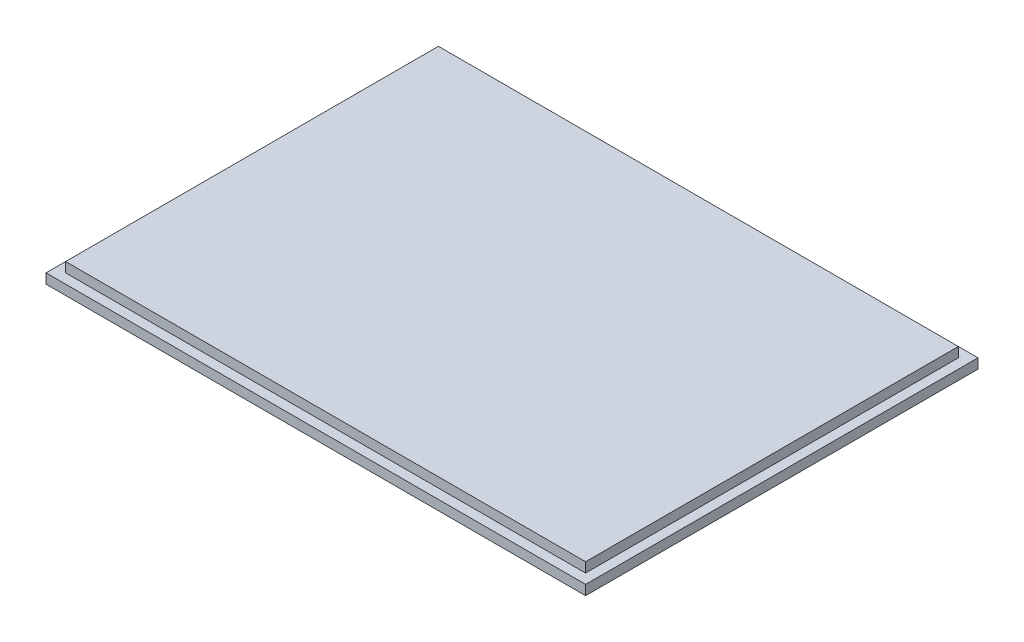
ISO-10303-21;
HEADER;
FILE_DESCRIPTION(('STEP AP214'),'2;1');
FILE_NAME('part.step','',(''),(''),'','','');
FILE_SCHEMA(('AUTOMOTIVE_DESIGN { 1 0 10303 214 1 1 1 1 }'));
ENDSEC;
DATA;
#1=APPLICATION_CONTEXT('core data for automotive mechanical design processes');
#2=APPLICATION_PROTOCOL_DEFINITION('international standard','automotive_design',2000,#1);
#3=PRODUCT_CONTEXT('',#1,'mechanical');
#4=PRODUCT('Part','Part','',(#3));
#5=PRODUCT_RELATED_PRODUCT_CATEGORY('part','',(#4));
#6=PRODUCT_DEFINITION_FORMATION('','',#4);
#7=PRODUCT_DEFINITION_CONTEXT('part definition',#1,'design');
#8=PRODUCT_DEFINITION('design','',#6,#7);
#9=PRODUCT_DEFINITION_SHAPE('','',#8);
#10=(LENGTH_UNIT() NAMED_UNIT(*) SI_UNIT(.MILLI.,.METRE.));
#11=(NAMED_UNIT(*) PLANE_ANGLE_UNIT() SI_UNIT($,.RADIAN.));
#12=(NAMED_UNIT(*) SI_UNIT($,.STERADIAN.) SOLID_ANGLE_UNIT());
#13=UNCERTAINTY_MEASURE_WITH_UNIT(LENGTH_MEASURE(1.E-05),#10,'distance_accuracy_value','');
#14=(GEOMETRIC_REPRESENTATION_CONTEXT(3) GLOBAL_UNCERTAINTY_ASSIGNED_CONTEXT((#13)) GLOBAL_UNIT_ASSIGNED_CONTEXT((#10,
#11,#12)) REPRESENTATION_CONTEXT('',''));
#15=CARTESIAN_POINT('',(0.,0.,0.));
#16=DIRECTION('',(0.,0.,1.));
#17=DIRECTION('',(1.,0.,0.));
#18=AXIS2_PLACEMENT_3D('',#15,#16,#17);
#19=CARTESIAN_POINT('',(110.,8.,80.));
#20=DIRECTION('',(-1.,0.,0.));
#21=DIRECTION('',(0.,0.,1.));
#22=AXIS2_PLACEMENT_3D('',#19,#20,#21);
#23=PLANE('',#22);
#24=DIRECTION('',(0.,-1.,0.));
#25=VECTOR('',#24,1.);
#26=CARTESIAN_POINT('',(110.,8.,-80.));
#27=LINE('',#26,#25);
#28=CARTESIAN_POINT('',(110.,4.,-80.));
#29=VERTEX_POINT('',#28);
#30=CARTESIAN_POINT('',(110.,0.,-80.));
#31=VERTEX_POINT('',#30);
#32=EDGE_CURVE('E11',#29,#31,#27,.T.);
#33=ORIENTED_EDGE('',*,*,#32,.F.);
#34=DIRECTION('',(0.,0.,-1.));
#35=VECTOR('',#34,1.);
#36=CARTESIAN_POINT('',(110.,4.,80.));
#37=LINE('',#36,#35);
#38=CARTESIAN_POINT('',(110.,4.,80.));
#39=VERTEX_POINT('',#38);
#40=EDGE_CURVE('E154',#39,#29,#37,.T.);
#41=ORIENTED_EDGE('',*,*,#40,.F.);
#42=DIRECTION('',(0.,-1.,0.));
#43=VECTOR('',#42,1.);
#44=CARTESIAN_POINT('',(110.,8.,80.));
#45=LINE('',#44,#43);
#46=CARTESIAN_POINT('',(110.,0.,80.));
#47=VERTEX_POINT('',#46);
#48=EDGE_CURVE('E186',#39,#47,#45,.T.);
#49=ORIENTED_EDGE('',*,*,#48,.T.);
#50=DIRECTION('',(0.,0.,-1.));
#51=VECTOR('',#50,1.);
#52=CARTESIAN_POINT('',(110.,0.,80.));
#53=LINE('',#52,#51);
#54=EDGE_CURVE('E170',#47,#31,#53,.T.);
#55=ORIENTED_EDGE('',*,*,#54,.T.);
#56=EDGE_LOOP('',(#33,#41,#49,#55));
#57=FACE_BOUND('',#56,.T.);
#58=ADVANCED_FACE('F43',(#57),#23,.F.);
#59=CARTESIAN_POINT('',(-110.,8.,-80.));
#60=DIRECTION('',(0.,0.,1.));
#61=DIRECTION('',(1.,0.,0.));
#62=AXIS2_PLACEMENT_3D('',#59,#60,#61);
#63=PLANE('',#62);
#64=DIRECTION('',(0.,-1.,0.));
#65=VECTOR('',#64,1.);
#66=CARTESIAN_POINT('',(-110.,8.,-80.));
#67=LINE('',#66,#65);
#68=CARTESIAN_POINT('',(-110.,4.,-80.));
#69=VERTEX_POINT('',#68);
#70=CARTESIAN_POINT('',(-110.,0.,-80.));
#71=VERTEX_POINT('',#70);
#72=EDGE_CURVE('E51',#69,#71,#67,.T.);
#73=ORIENTED_EDGE('',*,*,#72,.F.);
#74=DIRECTION('',(-1.,0.,0.));
#75=VECTOR('',#74,1.);
#76=CARTESIAN_POINT('',(-110.,4.,-80.));
#77=LINE('',#76,#75);
#78=EDGE_CURVE('E162',#29,#69,#77,.T.);
#79=ORIENTED_EDGE('',*,*,#78,.F.);
#80=ORIENTED_EDGE('',*,*,#32,.T.);
#81=DIRECTION('',(-1.,0.,0.));
#82=VECTOR('',#81,1.);
#83=CARTESIAN_POINT('',(-110.,0.,-80.));
#84=LINE('',#83,#82);
#85=EDGE_CURVE('E174',#31,#71,#84,.T.);
#86=ORIENTED_EDGE('',*,*,#85,.T.);
#87=EDGE_LOOP('',(#73,#79,#80,#86));
#88=FACE_BOUND('',#87,.T.);
#89=ADVANCED_FACE('F201',(#88),#63,.F.);
#90=CARTESIAN_POINT('',(-110.,8.,80.));
#91=DIRECTION('',(1.,0.,0.));
#92=DIRECTION('',(0.,0.,-1.));
#93=AXIS2_PLACEMENT_3D('',#90,#91,#92);
#94=PLANE('',#93);
#95=DIRECTION('',(0.,-1.,0.));
#96=VECTOR('',#95,1.);
#97=CARTESIAN_POINT('',(-110.,8.,80.));
#98=LINE('',#97,#96);
#99=CARTESIAN_POINT('',(-110.,4.,80.));
#100=VERTEX_POINT('',#99);
#101=CARTESIAN_POINT('',(-110.,0.,80.));
#102=VERTEX_POINT('',#101);
#103=EDGE_CURVE('E189',#100,#102,#98,.T.);
#104=ORIENTED_EDGE('',*,*,#103,.F.);
#105=DIRECTION('',(0.,0.,1.));
#106=VECTOR('',#105,1.);
#107=CARTESIAN_POINT('',(-110.,4.,80.));
#108=LINE('',#107,#106);
#109=EDGE_CURVE('E58',#69,#100,#108,.T.);
#110=ORIENTED_EDGE('',*,*,#109,.F.);
#111=ORIENTED_EDGE('',*,*,#72,.T.);
#112=DIRECTION('',(0.,0.,1.));
#113=VECTOR('',#112,1.);
#114=CARTESIAN_POINT('',(-110.,0.,80.));
#115=LINE('',#114,#113);
#116=EDGE_CURVE('E178',#71,#102,#115,.T.);
#117=ORIENTED_EDGE('',*,*,#116,.T.);
#118=EDGE_LOOP('',(#104,#110,#111,#117));
#119=FACE_BOUND('',#118,.T.);
#120=ADVANCED_FACE('F195',(#119),#94,.F.);
#121=CARTESIAN_POINT('',(-110.,8.,80.));
#122=DIRECTION('',(0.,0.,-1.));
#123=DIRECTION('',(-1.,0.,0.));
#124=AXIS2_PLACEMENT_3D('',#121,#122,#123);
#125=PLANE('',#124);
#126=ORIENTED_EDGE('',*,*,#48,.F.);
#127=DIRECTION('',(1.,0.,0.));
#128=VECTOR('',#127,1.);
#129=CARTESIAN_POINT('',(-110.,4.,80.));
#130=LINE('',#129,#128);
#131=EDGE_CURVE('E167',#100,#39,#130,.T.);
#132=ORIENTED_EDGE('',*,*,#131,.F.);
#133=ORIENTED_EDGE('',*,*,#103,.T.);
#134=DIRECTION('',(1.,0.,0.));
#135=VECTOR('',#134,1.);
#136=CARTESIAN_POINT('',(-110.,0.,80.));
#137=LINE('',#136,#135);
#138=EDGE_CURVE('E182',#102,#47,#137,.T.);
#139=ORIENTED_EDGE('',*,*,#138,.T.);
#140=EDGE_LOOP('',(#126,#132,#133,#139));
#141=FACE_BOUND('',#140,.T.);
#142=ADVANCED_FACE('F208',(#141),#125,.F.);
#143=CARTESIAN_POINT('',(0.,0.,0.));
#144=DIRECTION('',(0.,-1.,0.));
#145=DIRECTION('',(0.,0.,-1.));
#146=AXIS2_PLACEMENT_3D('',#143,#144,#145);
#147=PLANE('',#146);
#148=ORIENTED_EDGE('',*,*,#54,.F.);
#149=ORIENTED_EDGE('',*,*,#138,.F.);
#150=ORIENTED_EDGE('',*,*,#116,.F.);
#151=ORIENTED_EDGE('',*,*,#85,.F.);
#152=EDGE_LOOP('',(#148,#149,#150,#151));
#153=FACE_BOUND('',#152,.T.);
#154=ADVANCED_FACE('F205',(#153),#147,.T.);
#155=CARTESIAN_POINT('',(0.,4.,0.));
#156=DIRECTION('',(0.,-1.,0.));
#157=DIRECTION('',(0.,0.,-1.));
#158=AXIS2_PLACEMENT_3D('',#155,#156,#157);
#159=PLANE('',#158);
#160=DIRECTION('',(0.,0.,-1.));
#161=VECTOR('',#160,1.);
#162=CARTESIAN_POINT('',(106.,4.,76.));
#163=LINE('',#162,#161);
#164=CARTESIAN_POINT('',(106.,4.,76.));
#165=VERTEX_POINT('',#164);
#166=CARTESIAN_POINT('',(106.,4.,-76.));
#167=VERTEX_POINT('',#166);
#168=EDGE_CURVE('E126',#165,#167,#163,.T.);
#169=ORIENTED_EDGE('',*,*,#168,.F.);
#170=DIRECTION('',(1.,0.,0.));
#171=VECTOR('',#170,1.);
#172=CARTESIAN_POINT('',(-106.,4.,76.));
#173=LINE('',#172,#171);
#174=CARTESIAN_POINT('',(-106.,4.,76.));
#175=VERTEX_POINT('',#174);
#176=EDGE_CURVE('E120',#175,#165,#173,.T.);
#177=ORIENTED_EDGE('',*,*,#176,.F.);
#178=DIRECTION('',(0.,0.,1.));
#179=VECTOR('',#178,1.);
#180=CARTESIAN_POINT('',(-106.,4.,76.));
#181=LINE('',#180,#179);
#182=CARTESIAN_POINT('',(-106.,4.,-76.));
#183=VERTEX_POINT('',#182);
#184=EDGE_CURVE('E129',#183,#175,#181,.T.);
#185=ORIENTED_EDGE('',*,*,#184,.F.);
#186=DIRECTION('',(-1.,0.,0.));
#187=VECTOR('',#186,1.);
#188=CARTESIAN_POINT('',(-106.,4.,-76.));
#189=LINE('',#188,#187);
#190=EDGE_CURVE('E111',#167,#183,#189,.T.);
#191=ORIENTED_EDGE('',*,*,#190,.F.);
#192=EDGE_LOOP('',(#169,#177,#185,#191));
#193=FACE_BOUND('',#192,.T.);
#194=ORIENTED_EDGE('',*,*,#40,.T.);
#195=ORIENTED_EDGE('',*,*,#78,.T.);
#196=ORIENTED_EDGE('',*,*,#109,.T.);
#197=ORIENTED_EDGE('',*,*,#131,.T.);
#198=EDGE_LOOP('',(#194,#195,#196,#197));
#199=FACE_BOUND('',#198,.T.);
#200=ADVANCED_FACE('F124',(#193,#199),#159,.F.);
#201=CARTESIAN_POINT('',(106.,4.,76.));
#202=DIRECTION('',(1.,0.,0.));
#203=DIRECTION('',(0.,0.,-1.));
#204=AXIS2_PLACEMENT_3D('',#201,#202,#203);
#205=PLANE('',#204);
#206=DIRECTION('',(0.,0.,-1.));
#207=VECTOR('',#206,1.);
#208=CARTESIAN_POINT('',(106.,8.,76.));
#209=LINE('',#208,#207);
#210=CARTESIAN_POINT('',(106.,8.,76.));
#211=VERTEX_POINT('',#210);
#212=CARTESIAN_POINT('',(106.,8.,-76.));
#213=VERTEX_POINT('',#212);
#214=EDGE_CURVE('E145',#211,#213,#209,.T.);
#215=ORIENTED_EDGE('',*,*,#214,.F.);
#216=DIRECTION('',(0.,1.,0.));
#217=VECTOR('',#216,1.);
#218=CARTESIAN_POINT('',(106.,4.,76.));
#219=LINE('',#218,#217);
#220=EDGE_CURVE('E133',#165,#211,#219,.T.);
#221=ORIENTED_EDGE('',*,*,#220,.F.);
#222=ORIENTED_EDGE('',*,*,#168,.T.);
#223=DIRECTION('',(0.,1.,0.));
#224=VECTOR('',#223,1.);
#225=CARTESIAN_POINT('',(106.,4.,-76.));
#226=LINE('',#225,#224);
#227=EDGE_CURVE('E108',#167,#213,#226,.T.);
#228=ORIENTED_EDGE('',*,*,#227,.T.);
#229=EDGE_LOOP('',(#215,#221,#222,#228));
#230=FACE_BOUND('',#229,.T.);
#231=ADVANCED_FACE('F132',(#230),#205,.T.);
#232=CARTESIAN_POINT('',(-106.,4.,76.));
#233=DIRECTION('',(0.,0.,1.));
#234=DIRECTION('',(1.,0.,0.));
#235=AXIS2_PLACEMENT_3D('',#232,#233,#234);
#236=PLANE('',#235);
#237=DIRECTION('',(1.,0.,0.));
#238=VECTOR('',#237,1.);
#239=CARTESIAN_POINT('',(-106.,8.,76.));
#240=LINE('',#239,#238);
#241=CARTESIAN_POINT('',(-106.,8.,76.));
#242=VERTEX_POINT('',#241);
#243=EDGE_CURVE('E135',#242,#211,#240,.T.);
#244=ORIENTED_EDGE('',*,*,#243,.F.);
#245=DIRECTION('',(0.,1.,0.));
#246=VECTOR('',#245,1.);
#247=CARTESIAN_POINT('',(-106.,4.,76.));
#248=LINE('',#247,#246);
#249=EDGE_CURVE('E155',#175,#242,#248,.T.);
#250=ORIENTED_EDGE('',*,*,#249,.F.);
#251=ORIENTED_EDGE('',*,*,#176,.T.);
#252=ORIENTED_EDGE('',*,*,#220,.T.);
#253=EDGE_LOOP('',(#244,#250,#251,#252));
#254=FACE_BOUND('',#253,.T.);
#255=ADVANCED_FACE('F232',(#254),#236,.T.);
#256=CARTESIAN_POINT('',(-106.,4.,76.));
#257=DIRECTION('',(-1.,0.,0.));
#258=DIRECTION('',(0.,0.,1.));
#259=AXIS2_PLACEMENT_3D('',#256,#257,#258);
#260=PLANE('',#259);
#261=DIRECTION('',(0.,0.,1.));
#262=VECTOR('',#261,1.);
#263=CARTESIAN_POINT('',(-106.,8.,76.));
#264=LINE('',#263,#262);
#265=CARTESIAN_POINT('',(-106.,8.,-76.));
#266=VERTEX_POINT('',#265);
#267=EDGE_CURVE('E66',#266,#242,#264,.T.);
#268=ORIENTED_EDGE('',*,*,#267,.F.);
#269=DIRECTION('',(0.,1.,0.));
#270=VECTOR('',#269,1.);
#271=CARTESIAN_POINT('',(-106.,4.,-76.));
#272=LINE('',#271,#270);
#273=EDGE_CURVE('E119',#183,#266,#272,.T.);
#274=ORIENTED_EDGE('',*,*,#273,.F.);
#275=ORIENTED_EDGE('',*,*,#184,.T.);
#276=ORIENTED_EDGE('',*,*,#249,.T.);
#277=EDGE_LOOP('',(#268,#274,#275,#276));
#278=FACE_BOUND('',#277,.T.);
#279=ADVANCED_FACE('F235',(#278),#260,.T.);
#280=CARTESIAN_POINT('',(-106.,4.,-76.));
#281=DIRECTION('',(0.,0.,-1.));
#282=DIRECTION('',(-1.,0.,0.));
#283=AXIS2_PLACEMENT_3D('',#280,#281,#282);
#284=PLANE('',#283);
#285=DIRECTION('',(-1.,0.,0.));
#286=VECTOR('',#285,1.);
#287=CARTESIAN_POINT('',(-106.,8.,-76.));
#288=LINE('',#287,#286);
#289=EDGE_CURVE('E113',#213,#266,#288,.T.);
#290=ORIENTED_EDGE('',*,*,#289,.F.);
#291=ORIENTED_EDGE('',*,*,#227,.F.);
#292=ORIENTED_EDGE('',*,*,#190,.T.);
#293=ORIENTED_EDGE('',*,*,#273,.T.);
#294=EDGE_LOOP('',(#290,#291,#292,#293));
#295=FACE_BOUND('',#294,.T.);
#296=ADVANCED_FACE('F110',(#295),#284,.T.);
#297=CARTESIAN_POINT('',(0.,8.,0.));
#298=DIRECTION('',(0.,-1.,0.));
#299=DIRECTION('',(0.,0.,-1.));
#300=AXIS2_PLACEMENT_3D('',#297,#298,#299);
#301=PLANE('',#300);
#302=ORIENTED_EDGE('',*,*,#214,.T.);
#303=ORIENTED_EDGE('',*,*,#289,.T.);
#304=ORIENTED_EDGE('',*,*,#267,.T.);
#305=ORIENTED_EDGE('',*,*,#243,.T.);
#306=EDGE_LOOP('',(#302,#303,#304,#305));
#307=FACE_BOUND('',#306,.T.);
#308=ADVANCED_FACE('F224',(#307),#301,.F.);
#309=CLOSED_SHELL('',(#58,#89,#120,#142,#154,#200,#231,#255,#279,#296,#308));
#310=MANIFOLD_SOLID_BREP('B2',#309);
#311=ADVANCED_BREP_SHAPE_REPRESENTATION('',(#18,#310),#14);
#312=SHAPE_DEFINITION_REPRESENTATION(#9,#311);
ENDSEC;
END-ISO-10303-21;
